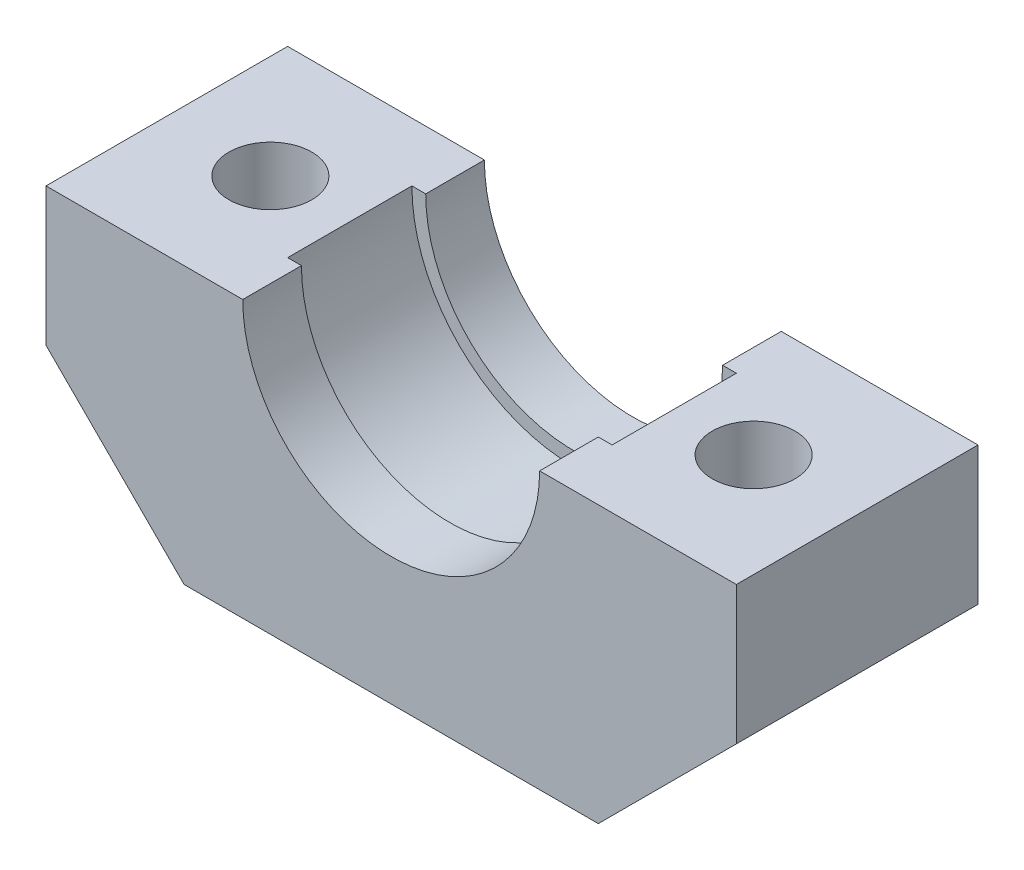
ISO-10303-21;
HEADER;
FILE_DESCRIPTION(('STEP AP214'),'2;1');
FILE_NAME('part.step','',(''),(''),'','','');
FILE_SCHEMA(('AUTOMOTIVE_DESIGN { 1 0 10303 214 1 1 1 1 }'));
ENDSEC;
DATA;
#1=APPLICATION_CONTEXT('core data for automotive mechanical design processes');
#2=APPLICATION_PROTOCOL_DEFINITION('international standard','automotive_design',2000,#1);
#3=PRODUCT_CONTEXT('',#1,'mechanical');
#4=PRODUCT('Part','Part','',(#3));
#5=PRODUCT_RELATED_PRODUCT_CATEGORY('part','',(#4));
#6=PRODUCT_DEFINITION_FORMATION('','',#4);
#7=PRODUCT_DEFINITION_CONTEXT('part definition',#1,'design');
#8=PRODUCT_DEFINITION('design','',#6,#7);
#9=PRODUCT_DEFINITION_SHAPE('','',#8);
#10=(LENGTH_UNIT() NAMED_UNIT(*) SI_UNIT(.MILLI.,.METRE.));
#11=(NAMED_UNIT(*) PLANE_ANGLE_UNIT() SI_UNIT($,.RADIAN.));
#12=(NAMED_UNIT(*) SI_UNIT($,.STERADIAN.) SOLID_ANGLE_UNIT());
#13=UNCERTAINTY_MEASURE_WITH_UNIT(LENGTH_MEASURE(1.E-05),#10,'distance_accuracy_value','');
#14=(GEOMETRIC_REPRESENTATION_CONTEXT(3) GLOBAL_UNCERTAINTY_ASSIGNED_CONTEXT((#13)) GLOBAL_UNIT_ASSIGNED_CONTEXT((#10,
#11,#12)) REPRESENTATION_CONTEXT('',''));
#15=CARTESIAN_POINT('',(0.,0.,0.));
#16=DIRECTION('',(0.,0.,1.));
#17=DIRECTION('',(1.,0.,0.));
#18=AXIS2_PLACEMENT_3D('',#15,#16,#17);
#19=CARTESIAN_POINT('',(28.4999999999999,-1.11022302462516E-13,17.5));
#20=DIRECTION('',(0.,-1.,0.));
#21=DIRECTION('',(1.,0.,0.));
#22=AXIS2_PLACEMENT_3D('',#19,#20,#21);
#23=PLANE('',#22);
#24=CARTESIAN_POINT('',(14.9999999999998,1.11022302462516E-13,0.));
#25=DIRECTION('',(0.,1.,0.));
#26=DIRECTION('',(0.,0.,1.));
#27=AXIS2_PLACEMENT_3D('',#24,#25,#26);
#28=CIRCLE('',#27,5.99999999999999);
#29=CARTESIAN_POINT('',(14.9999999999998,1.11065739355025E-13,5.99999999999999));
#30=VERTEX_POINT('',#29);
#31=EDGE_CURVE('E249',#30,#30,#28,.T.);
#32=ORIENTED_EDGE('',*,*,#31,.F.);
#33=EDGE_LOOP('',(#32));
#34=FACE_BOUND('',#33,.T.);
#35=DIRECTION('',(-1.,0.,0.));
#36=VECTOR('',#35,1.);
#37=CARTESIAN_POINT('',(28.4999999999999,-1.11022302462516E-13,-9.00000000000001));
#38=LINE('',#37,#36);
#39=CARTESIAN_POINT('',(28.4999999999999,-1.11022302462516E-13,-9.00000000000001));
#40=VERTEX_POINT('',#39);
#41=CARTESIAN_POINT('',(26.5,-1.11022302462516E-13,-9.00000000000001));
#42=VERTEX_POINT('',#41);
#43=EDGE_CURVE('E193',#40,#42,#38,.T.);
#44=ORIENTED_EDGE('',*,*,#43,.F.);
#45=DIRECTION('',(0.,0.,-1.));
#46=VECTOR('',#45,1.);
#47=CARTESIAN_POINT('',(28.4999999999999,-1.11022302462516E-13,17.5));
#48=LINE('',#47,#46);
#49=CARTESIAN_POINT('',(28.4999999999999,-1.11022302462516E-13,-17.5000000000001));
#50=VERTEX_POINT('',#49);
#51=EDGE_CURVE('E95',#40,#50,#48,.T.);
#52=ORIENTED_EDGE('',*,*,#51,.T.);
#53=DIRECTION('',(-1.,0.,0.));
#54=VECTOR('',#53,1.);
#55=CARTESIAN_POINT('',(28.4999999999999,-1.11022302462516E-13,-17.5000000000001));
#56=LINE('',#55,#54);
#57=CARTESIAN_POINT('',(1.11022302462516E-13,-1.11022302462516E-13,-17.5000000000003));
#58=VERTEX_POINT('',#57);
#59=EDGE_CURVE('E150',#50,#58,#56,.T.);
#60=ORIENTED_EDGE('',*,*,#59,.T.);
#61=DIRECTION('',(0.,0.,-1.));
#62=VECTOR('',#61,1.);
#63=CARTESIAN_POINT('',(-1.66533453693773E-13,1.11022302462516E-13,17.4999999999996));
#64=LINE('',#63,#62);
#65=CARTESIAN_POINT('',(-1.66533453693773E-13,1.11022302462516E-13,17.4999999999996));
#66=VERTEX_POINT('',#65);
#67=EDGE_CURVE('E182',#66,#58,#64,.T.);
#68=ORIENTED_EDGE('',*,*,#67,.F.);
#69=DIRECTION('',(-1.,0.,0.));
#70=VECTOR('',#69,1.);
#71=CARTESIAN_POINT('',(28.4999999999999,-1.11022302462516E-13,17.5));
#72=LINE('',#71,#70);
#73=CARTESIAN_POINT('',(28.4999999999999,-1.11022302462516E-13,17.5));
#74=VERTEX_POINT('',#73);
#75=EDGE_CURVE('E166',#74,#66,#72,.T.);
#76=ORIENTED_EDGE('',*,*,#75,.F.);
#77=CARTESIAN_POINT('',(28.4999999999999,-1.11022302462516E-13,9.00000000000001));
#78=VERTEX_POINT('',#77);
#79=EDGE_CURVE('E167',#74,#78,#48,.T.);
#80=ORIENTED_EDGE('',*,*,#79,.T.);
#81=DIRECTION('',(-1.,0.,0.));
#82=VECTOR('',#81,1.);
#83=CARTESIAN_POINT('',(28.4999999999999,-1.11022302462516E-13,9.00000000000001));
#84=LINE('',#83,#82);
#85=CARTESIAN_POINT('',(26.5000000000001,-1.11022302462516E-13,9.00000000000001));
#86=VERTEX_POINT('',#85);
#87=EDGE_CURVE('E52',#78,#86,#84,.T.);
#88=ORIENTED_EDGE('',*,*,#87,.T.);
#89=DIRECTION('',(0.,0.,1.));
#90=VECTOR('',#89,1.);
#91=CARTESIAN_POINT('',(26.5,-1.11022302462516E-13,-9.00000000000001));
#92=LINE('',#91,#90);
#93=EDGE_CURVE('E153',#86,#42,#92,.F.);
#94=ORIENTED_EDGE('',*,*,#93,.T.);
#95=EDGE_LOOP('',(#44,#52,#60,#68,#76,#80,#88,#94));
#96=FACE_BOUND('',#95,.T.);
#97=ADVANCED_FACE('F38',(#34,#96),#23,.F.);
#98=CARTESIAN_POINT('',(100.,-1.11022302462516E-13,17.5));
#99=DIRECTION('',(0.,-1.,0.));
#100=DIRECTION('',(1.,0.,0.));
#101=AXIS2_PLACEMENT_3D('',#98,#99,#100);
#102=PLANE('',#101);
#103=CARTESIAN_POINT('',(84.9999999999999,1.11022302462516E-13,-5.55111512312578E-13));
#104=DIRECTION('',(0.,1.,0.));
#105=DIRECTION('',(0.,0.,1.));
#106=AXIS2_PLACEMENT_3D('',#103,#104,#105);
#107=CIRCLE('',#106,5.99999999999999);
#108=CARTESIAN_POINT('',(84.9999999999999,1.11065739355025E-13,5.99999999999944));
#109=VERTEX_POINT('',#108);
#110=EDGE_CURVE('E243',#109,#109,#107,.T.);
#111=ORIENTED_EDGE('',*,*,#110,.F.);
#112=EDGE_LOOP('',(#111));
#113=FACE_BOUND('',#112,.T.);
#114=DIRECTION('',(-1.,0.,0.));
#115=VECTOR('',#114,1.);
#116=CARTESIAN_POINT('',(99.9999999999999,-1.11022302462516E-13,-9.00000000000001));
#117=LINE('',#116,#115);
#118=CARTESIAN_POINT('',(73.4999999999998,-1.11022302462516E-13,-9.00000000000056));
#119=VERTEX_POINT('',#118);
#120=CARTESIAN_POINT('',(71.5,-2.18522477890559E-06,-9.00000000000056));
#121=VERTEX_POINT('',#120);
#122=EDGE_CURVE('E196',#119,#121,#117,.T.);
#123=ORIENTED_EDGE('',*,*,#122,.F.);
#124=DIRECTION('',(0.,0.,1.));
#125=VECTOR('',#124,1.);
#126=CARTESIAN_POINT('',(73.4999999999998,-1.11022302462516E-13,-9.00000000000056));
#127=LINE('',#126,#125);
#128=CARTESIAN_POINT('',(73.4999999999998,-1.11022302462516E-13,8.99999999999945));
#129=VERTEX_POINT('',#128);
#130=EDGE_CURVE('E11',#119,#129,#127,.T.);
#131=ORIENTED_EDGE('',*,*,#130,.T.);
#132=DIRECTION('',(-1.,0.,0.));
#133=VECTOR('',#132,1.);
#134=CARTESIAN_POINT('',(99.9999999999999,-1.11022302462516E-13,9.00000000000001));
#135=LINE('',#134,#133);
#136=CARTESIAN_POINT('',(71.4999999999999,-2.18522477890559E-06,8.99999999999945));
#137=VERTEX_POINT('',#136);
#138=EDGE_CURVE('E233',#129,#137,#135,.T.);
#139=ORIENTED_EDGE('',*,*,#138,.T.);
#140=DIRECTION('',(0.,0.,-1.));
#141=VECTOR('',#140,1.);
#142=CARTESIAN_POINT('',(71.5,-1.11022302462516E-13,17.4999999999995));
#143=LINE('',#142,#141);
#144=CARTESIAN_POINT('',(71.5,-1.11022302462516E-13,17.4999999999995));
#145=VERTEX_POINT('',#144);
#146=EDGE_CURVE('E140',#145,#137,#143,.T.);
#147=ORIENTED_EDGE('',*,*,#146,.F.);
#148=DIRECTION('',(-1.,0.,0.));
#149=VECTOR('',#148,1.);
#150=CARTESIAN_POINT('',(100.,-1.11022302462516E-13,17.5));
#151=LINE('',#150,#149);
#152=CARTESIAN_POINT('',(100.,-1.11022302462516E-13,17.5));
#153=VERTEX_POINT('',#152);
#154=EDGE_CURVE('E123',#153,#145,#151,.T.);
#155=ORIENTED_EDGE('',*,*,#154,.F.);
#156=DIRECTION('',(0.,0.,-1.));
#157=VECTOR('',#156,1.);
#158=CARTESIAN_POINT('',(100.,-1.11022302462516E-13,17.5));
#159=LINE('',#158,#157);
#160=CARTESIAN_POINT('',(99.9999999999998,-1.11022302462516E-13,-17.5));
#161=VERTEX_POINT('',#160);
#162=EDGE_CURVE('E132',#153,#161,#159,.T.);
#163=ORIENTED_EDGE('',*,*,#162,.T.);
#164=DIRECTION('',(-1.,0.,0.));
#165=VECTOR('',#164,1.);
#166=CARTESIAN_POINT('',(99.9999999999998,-1.11022302462516E-13,-17.5));
#167=LINE('',#166,#165);
#168=CARTESIAN_POINT('',(71.4999999999999,-1.11022302462516E-13,-17.5000000000005));
#169=VERTEX_POINT('',#168);
#170=EDGE_CURVE('E162',#161,#169,#167,.T.);
#171=ORIENTED_EDGE('',*,*,#170,.T.);
#172=EDGE_CURVE('E170',#121,#169,#143,.T.);
#173=ORIENTED_EDGE('',*,*,#172,.F.);
#174=EDGE_LOOP('',(#123,#131,#139,#147,#155,#163,#171,#173));
#175=FACE_BOUND('',#174,.T.);
#176=ADVANCED_FACE('F143',(#113,#175),#102,.F.);
#177=CARTESIAN_POINT('',(49.9999999999999,-2.18522466788329E-06,17.4999999999997));
#178=DIRECTION('',(0.,0.,-1.));
#179=DIRECTION('',(-1.,0.,0.));
#180=AXIS2_PLACEMENT_3D('',#177,#178,#179);
#181=CYLINDRICAL_SURFACE('',#180,21.5000000000001);
#182=CARTESIAN_POINT('',(49.9999999999999,-2.18522477890559E-06,-9.00000000000034));
#183=DIRECTION('',(0.,0.,1.));
#184=DIRECTION('',(1.,0.,0.));
#185=AXIS2_PLACEMENT_3D('',#182,#183,#184);
#186=CIRCLE('',#185,21.5000000000001);
#187=EDGE_CURVE('E45',#121,#40,#186,.F.);
#188=ORIENTED_EDGE('',*,*,#187,.F.);
#189=ORIENTED_EDGE('',*,*,#172,.T.);
#190=CARTESIAN_POINT('',(49.9999999999998,-2.18522488992789E-06,-17.5000000000003));
#191=DIRECTION('',(0.,0.,-1.));
#192=DIRECTION('',(1.,0.,0.));
#193=AXIS2_PLACEMENT_3D('',#190,#191,#192);
#194=CIRCLE('',#193,21.5000000000001);
#195=EDGE_CURVE('E164',#169,#50,#194,.T.);
#196=ORIENTED_EDGE('',*,*,#195,.T.);
#197=ORIENTED_EDGE('',*,*,#51,.F.);
#198=EDGE_LOOP('',(#188,#189,#196,#197));
#199=FACE_BOUND('',#198,.T.);
#200=ADVANCED_FACE('F202',(#199),#181,.F.);
#201=CARTESIAN_POINT('',(-1.66533453693773E-13,1.11022302462516E-13,17.4999999999996));
#202=DIRECTION('',(1.,0.,0.));
#203=DIRECTION('',(0.,1.,0.));
#204=AXIS2_PLACEMENT_3D('',#201,#202,#203);
#205=PLANE('',#204);
#206=DIRECTION('',(0.,-1.,0.));
#207=VECTOR('',#206,1.);
#208=CARTESIAN_POINT('',(1.11022302462516E-13,-1.11022302462516E-13,-17.5000000000003));
#209=LINE('',#208,#207);
#210=CARTESIAN_POINT('',(0.,-20.,-17.5000000000003));
#211=VERTEX_POINT('',#210);
#212=EDGE_CURVE('E152',#58,#211,#209,.T.);
#213=ORIENTED_EDGE('',*,*,#212,.T.);
#214=DIRECTION('',(0.,0.,-1.));
#215=VECTOR('',#214,1.);
#216=CARTESIAN_POINT('',(-1.66533453693773E-13,-20.,17.4999999999997));
#217=LINE('',#216,#215);
#218=CARTESIAN_POINT('',(-1.66533453693773E-13,-20.,17.4999999999997));
#219=VERTEX_POINT('',#218);
#220=EDGE_CURVE('E179',#219,#211,#217,.T.);
#221=ORIENTED_EDGE('',*,*,#220,.F.);
#222=DIRECTION('',(0.,-1.,0.));
#223=VECTOR('',#222,1.);
#224=CARTESIAN_POINT('',(-1.66533453693773E-13,1.11022302462516E-13,17.4999999999996));
#225=LINE('',#224,#223);
#226=EDGE_CURVE('E104',#66,#219,#225,.T.);
#227=ORIENTED_EDGE('',*,*,#226,.F.);
#228=ORIENTED_EDGE('',*,*,#67,.T.);
#229=EDGE_LOOP('',(#213,#221,#227,#228));
#230=FACE_BOUND('',#229,.T.);
#231=ADVANCED_FACE('F210',(#230),#205,.F.);
#232=CARTESIAN_POINT('',(-1.66533453693773E-13,-20.,17.4999999999997));
#233=DIRECTION('',(0.707106781186548,0.707106781186549,0.));
#234=DIRECTION('',(-0.707106781186548,0.707106781186549,0.));
#235=AXIS2_PLACEMENT_3D('',#232,#233,#234);
#236=PLANE('',#235);
#237=DIRECTION('',(0.707106781186548,-0.707106781186549,0.));
#238=VECTOR('',#237,1.);
#239=CARTESIAN_POINT('',(0.,-20.,-17.5000000000003));
#240=LINE('',#239,#238);
#241=CARTESIAN_POINT('',(19.9999999999999,-40.0000000000001,-17.5000000000001));
#242=VERTEX_POINT('',#241);
#243=EDGE_CURVE('E155',#211,#242,#240,.T.);
#244=ORIENTED_EDGE('',*,*,#243,.T.);
#245=DIRECTION('',(0.,0.,-1.));
#246=VECTOR('',#245,1.);
#247=CARTESIAN_POINT('',(19.9999999999999,-39.9999999999999,17.5));
#248=LINE('',#247,#246);
#249=CARTESIAN_POINT('',(19.9999999999999,-39.9999999999999,17.5));
#250=VERTEX_POINT('',#249);
#251=EDGE_CURVE('E176',#250,#242,#248,.T.);
#252=ORIENTED_EDGE('',*,*,#251,.F.);
#253=DIRECTION('',(0.707106781186548,-0.707106781186549,0.));
#254=VECTOR('',#253,1.);
#255=CARTESIAN_POINT('',(-1.66533453693773E-13,-20.,17.4999999999997));
#256=LINE('',#255,#254);
#257=EDGE_CURVE('E215',#219,#250,#256,.T.);
#258=ORIENTED_EDGE('',*,*,#257,.F.);
#259=ORIENTED_EDGE('',*,*,#220,.T.);
#260=EDGE_LOOP('',(#244,#252,#258,#259));
#261=FACE_BOUND('',#260,.T.);
#262=ADVANCED_FACE('F213',(#261),#236,.F.);
#263=CARTESIAN_POINT('',(19.9999999999999,-39.9999999999999,17.5));
#264=DIRECTION('',(0.,1.,0.));
#265=DIRECTION('',(0.,0.,1.));
#266=AXIS2_PLACEMENT_3D('',#263,#264,#265);
#267=PLANE('',#266);
#268=DIRECTION('',(1.,0.,0.));
#269=VECTOR('',#268,1.);
#270=CARTESIAN_POINT('',(19.9999999999999,-40.0000000000001,-17.5000000000001));
#271=LINE('',#270,#269);
#272=CARTESIAN_POINT('',(79.9999999999998,-40.0000000000001,-17.5000000000005));
#273=VERTEX_POINT('',#272);
#274=EDGE_CURVE('E157',#242,#273,#271,.T.);
#275=ORIENTED_EDGE('',*,*,#274,.T.);
#276=DIRECTION('',(0.,0.,-1.));
#277=VECTOR('',#276,1.);
#278=CARTESIAN_POINT('',(79.9999999999999,-39.9999999999999,17.4999999999994));
#279=LINE('',#278,#277);
#280=CARTESIAN_POINT('',(79.9999999999999,-39.9999999999999,17.4999999999994));
#281=VERTEX_POINT('',#280);
#282=EDGE_CURVE('E173',#281,#273,#279,.T.);
#283=ORIENTED_EDGE('',*,*,#282,.F.);
#284=DIRECTION('',(1.,0.,0.));
#285=VECTOR('',#284,1.);
#286=CARTESIAN_POINT('',(19.9999999999999,-39.9999999999999,17.5));
#287=LINE('',#286,#285);
#288=EDGE_CURVE('E224',#250,#281,#287,.T.);
#289=ORIENTED_EDGE('',*,*,#288,.F.);
#290=ORIENTED_EDGE('',*,*,#251,.T.);
#291=EDGE_LOOP('',(#275,#283,#289,#290));
#292=FACE_BOUND('',#291,.T.);
#293=ADVANCED_FACE('F220',(#292),#267,.F.);
#294=CARTESIAN_POINT('',(79.9999999999999,-39.9999999999999,17.4999999999994));
#295=DIRECTION('',(-0.707106781186548,0.707106781186549,0.));
#296=DIRECTION('',(-0.707106781186548,-0.707106781186549,0.));
#297=AXIS2_PLACEMENT_3D('',#294,#295,#296);
#298=PLANE('',#297);
#299=CARTESIAN_POINT('',(83.5355339059327,-36.4644660940674,-2.22044604925031E-13));
#300=DIRECTION('',(0.707106781186548,-0.707106781186549,0.));
#301=DIRECTION('',(0.707106781186548,0.707106781186549,0.));
#302=AXIS2_PLACEMENT_3D('',#299,#300,#301);
#303=CIRCLE('',#302,2.49999999999999);
#304=CARTESIAN_POINT('',(85.3033008588991,-34.696699141101,-2.22031811088939E-13));
#305=VERTEX_POINT('',#304);
#306=EDGE_CURVE('E252',#305,#305,#303,.T.);
#307=ORIENTED_EDGE('',*,*,#306,.F.);
#308=EDGE_LOOP('',(#307));
#309=FACE_BOUND('',#308,.T.);
#310=DIRECTION('',(0.707106781186548,0.707106781186549,0.));
#311=VECTOR('',#310,1.);
#312=CARTESIAN_POINT('',(79.9999999999998,-40.0000000000001,-17.5000000000005));
#313=LINE('',#312,#311);
#314=CARTESIAN_POINT('',(99.9999999999999,-20.,-17.5000000000003));
#315=VERTEX_POINT('',#314);
#316=EDGE_CURVE('E159',#273,#315,#313,.T.);
#317=ORIENTED_EDGE('',*,*,#316,.T.);
#318=DIRECTION('',(0.,0.,-1.));
#319=VECTOR('',#318,1.);
#320=CARTESIAN_POINT('',(99.9999999999999,-19.9999999999999,17.4999999999997));
#321=LINE('',#320,#319);
#322=CARTESIAN_POINT('',(99.9999999999999,-19.9999999999999,17.4999999999997));
#323=VERTEX_POINT('',#322);
#324=EDGE_CURVE('E139',#323,#315,#321,.T.);
#325=ORIENTED_EDGE('',*,*,#324,.F.);
#326=DIRECTION('',(0.707106781186548,0.707106781186549,0.));
#327=VECTOR('',#326,1.);
#328=CARTESIAN_POINT('',(79.9999999999999,-39.9999999999999,17.4999999999994));
#329=LINE('',#328,#327);
#330=EDGE_CURVE('E126',#281,#323,#329,.T.);
#331=ORIENTED_EDGE('',*,*,#330,.F.);
#332=ORIENTED_EDGE('',*,*,#282,.T.);
#333=EDGE_LOOP('',(#317,#325,#331,#332));
#334=FACE_BOUND('',#333,.T.);
#335=ADVANCED_FACE('F223',(#309,#334),#298,.F.);
#336=CARTESIAN_POINT('',(99.9999999999999,-19.9999999999999,17.4999999999997));
#337=DIRECTION('',(-1.,0.,0.));
#338=DIRECTION('',(0.,0.,1.));
#339=AXIS2_PLACEMENT_3D('',#336,#337,#338);
#340=PLANE('',#339);
#341=DIRECTION('',(0.,1.,0.));
#342=VECTOR('',#341,1.);
#343=CARTESIAN_POINT('',(99.9999999999999,-20.,-17.5000000000003));
#344=LINE('',#343,#342);
#345=EDGE_CURVE('E135',#315,#161,#344,.T.);
#346=ORIENTED_EDGE('',*,*,#345,.T.);
#347=ORIENTED_EDGE('',*,*,#162,.F.);
#348=DIRECTION('',(0.,1.,0.));
#349=VECTOR('',#348,1.);
#350=CARTESIAN_POINT('',(99.9999999999999,-19.9999999999999,17.4999999999997));
#351=LINE('',#350,#349);
#352=EDGE_CURVE('E119',#323,#153,#351,.T.);
#353=ORIENTED_EDGE('',*,*,#352,.F.);
#354=ORIENTED_EDGE('',*,*,#324,.T.);
#355=EDGE_LOOP('',(#346,#347,#353,#354));
#356=FACE_BOUND('',#355,.T.);
#357=ADVANCED_FACE('F133',(#356),#340,.F.);
#358=ORIENTED_EDGE('',*,*,#146,.T.);
#359=CARTESIAN_POINT('',(49.9999999999999,-2.18522477890559E-06,8.99999999999967));
#360=DIRECTION('',(0.,0.,1.));
#361=DIRECTION('',(1.,0.,0.));
#362=AXIS2_PLACEMENT_3D('',#359,#360,#361);
#363=CIRCLE('',#362,21.5000000000001);
#364=EDGE_CURVE('E184',#137,#78,#363,.F.);
#365=ORIENTED_EDGE('',*,*,#364,.T.);
#366=ORIENTED_EDGE('',*,*,#79,.F.);
#367=CARTESIAN_POINT('',(49.9999999999999,-2.18522466788329E-06,17.4999999999997));
#368=DIRECTION('',(0.,0.,-1.));
#369=DIRECTION('',(1.,0.,0.));
#370=AXIS2_PLACEMENT_3D('',#367,#368,#369);
#371=CIRCLE('',#370,21.5000000000001);
#372=EDGE_CURVE('E61',#145,#74,#371,.T.);
#373=ORIENTED_EDGE('',*,*,#372,.F.);
#374=EDGE_LOOP('',(#358,#365,#366,#373));
#375=FACE_BOUND('',#374,.T.);
#376=ADVANCED_FACE('F306',(#375),#181,.F.);
#377=CARTESIAN_POINT('',(49.9999999999999,-2.18522466788329E-06,17.4999999999997));
#378=DIRECTION('',(0.,0.,1.));
#379=DIRECTION('',(1.,0.,0.));
#380=AXIS2_PLACEMENT_3D('',#377,#378,#379);
#381=PLANE('',#380);
#382=ORIENTED_EDGE('',*,*,#75,.T.);
#383=ORIENTED_EDGE('',*,*,#226,.T.);
#384=ORIENTED_EDGE('',*,*,#257,.T.);
#385=ORIENTED_EDGE('',*,*,#288,.T.);
#386=ORIENTED_EDGE('',*,*,#330,.T.);
#387=ORIENTED_EDGE('',*,*,#352,.T.);
#388=ORIENTED_EDGE('',*,*,#154,.T.);
#389=ORIENTED_EDGE('',*,*,#372,.T.);
#390=EDGE_LOOP('',(#382,#383,#384,#385,#386,#387,#388,#389));
#391=FACE_BOUND('',#390,.T.);
#392=ADVANCED_FACE('F121',(#391),#381,.T.);
#393=CARTESIAN_POINT('',(49.9999999999998,-2.18522488992789E-06,-17.5000000000003));
#394=DIRECTION('',(0.,0.,1.));
#395=DIRECTION('',(1.,0.,0.));
#396=AXIS2_PLACEMENT_3D('',#393,#394,#395);
#397=PLANE('',#396);
#398=ORIENTED_EDGE('',*,*,#59,.F.);
#399=ORIENTED_EDGE('',*,*,#195,.F.);
#400=ORIENTED_EDGE('',*,*,#170,.F.);
#401=ORIENTED_EDGE('',*,*,#345,.F.);
#402=ORIENTED_EDGE('',*,*,#316,.F.);
#403=ORIENTED_EDGE('',*,*,#274,.F.);
#404=ORIENTED_EDGE('',*,*,#243,.F.);
#405=ORIENTED_EDGE('',*,*,#212,.F.);
#406=EDGE_LOOP('',(#398,#399,#400,#401,#402,#403,#404,#405));
#407=FACE_BOUND('',#406,.T.);
#408=ADVANCED_FACE('F206',(#407),#397,.F.);
#409=CARTESIAN_POINT('',(49.9999999999999,-2.18522477890559E-06,-9.00000000000023));
#410=DIRECTION('',(0.,0.,1.));
#411=DIRECTION('',(1.,0.,0.));
#412=AXIS2_PLACEMENT_3D('',#409,#410,#411);
#413=CYLINDRICAL_SURFACE('',#412,23.5);
#414=CARTESIAN_POINT('',(66.9175430694863,-16.3109413516882,-2.22044604925031E-13));
#415=CARTESIAN_POINT('',(66.917539715428,-16.3109463979526,0.14043709387495));
#416=CARTESIAN_POINT('',(66.9093079780531,-16.3194960832725,0.280965450057372));
#417=CARTESIAN_POINT('',(66.8765129469494,-16.3534069120574,0.55813948220931));
#418=CARTESIAN_POINT('',(66.8519319435179,-16.3787862855343,0.694780780125926));
#419=CARTESIAN_POINT('',(66.7869178109053,-16.4454132343716,0.960143506697454));
#420=CARTESIAN_POINT('',(66.7464915352159,-16.4866539491455,1.08886833162172));
#421=CARTESIAN_POINT('',(66.6506049017876,-16.5834872457945,1.3347659526855));
#422=CARTESIAN_POINT('',(66.5951478401806,-16.6390766809819,1.45194127386615));
#423=CARTESIAN_POINT('',(66.4703564587993,-16.7626106628878,1.67144112948376));
#424=CARTESIAN_POINT('',(66.4010229506232,-16.8305544870082,1.77376653185129));
#425=CARTESIAN_POINT('',(66.2500017731221,-16.9764104760256,1.96066176509413));
#426=CARTESIAN_POINT('',(66.1683139042594,-17.0543228019227,2.04523130913849));
#427=CARTESIAN_POINT('',(65.9946725309082,-17.2172777337704,2.19405651597188));
#428=CARTESIAN_POINT('',(65.9027398568567,-17.3023057868923,2.25835241622135));
#429=CARTESIAN_POINT('',(65.7107584955868,-17.4768118834317,2.36505631249942));
#430=CARTESIAN_POINT('',(65.6107099869186,-17.5662898289337,2.40746478990521));
#431=CARTESIAN_POINT('',(65.4052836240823,-17.746716968396,2.46920126695664));
#432=CARTESIAN_POINT('',(65.2999146467525,-17.8376635501098,2.48856646747808));
#433=CARTESIAN_POINT('',(65.0865721401381,-18.0184619260894,2.50389188568737));
#434=CARTESIAN_POINT('',(64.9785985606953,-18.1083136992216,2.49985165228643));
#435=CARTESIAN_POINT('',(64.7626285307724,-18.2848138058624,2.46852371102295));
#436=CARTESIAN_POINT('',(64.6546339795446,-18.3714466981013,2.44113608383504));
#437=CARTESIAN_POINT('',(64.4422401405273,-18.5388802995531,2.36384433311063));
#438=CARTESIAN_POINT('',(64.3378410899465,-18.6196806243531,2.31393872702843));
#439=CARTESIAN_POINT('',(64.1347972816674,-18.774292055734,2.19245426361295));
#440=CARTESIAN_POINT('',(64.0362177131337,-18.8480282598815,2.12067107113133));
#441=CARTESIAN_POINT('',(63.8490356596651,-18.9859904936977,1.95759626755379));
#442=CARTESIAN_POINT('',(63.760433637804,-19.0502160820069,1.86630375156822));
#443=CARTESIAN_POINT('',(63.5957658747619,-19.1680868984566,1.66623017690321));
#444=CARTESIAN_POINT('',(63.5197592634571,-19.2216824425207,1.55737111640797));
#445=CARTESIAN_POINT('',(63.3834692581028,-19.3168259872731,1.32546340639511));
#446=CARTESIAN_POINT('',(63.3231850293153,-19.3583746275729,1.20241551069629));
#447=CARTESIAN_POINT('',(63.2210932503046,-19.428242002603,0.946828051408499));
#448=CARTESIAN_POINT('',(63.1791148051062,-19.4566832510735,0.814390315039674));
#449=CARTESIAN_POINT('',(63.1144445682653,-19.5003324975694,0.542797502789418));
#450=CARTESIAN_POINT('',(63.0917505393248,-19.5155420306886,0.403643208115386));
#451=CARTESIAN_POINT('',(63.0667766199694,-19.5322722252149,0.125084368977753));
#452=CARTESIAN_POINT('',(63.0641589896875,-19.5340193632346,-0.0142763981953614));
#453=CARTESIAN_POINT('',(63.0785511096671,-19.5243862636765,-0.291517192537117));
#454=CARTESIAN_POINT('',(63.0955599336822,-19.5130066455998,-0.429397289274241));
#455=CARTESIAN_POINT('',(63.1483585007257,-19.4774676556973,-0.698860453159516));
#456=CARTESIAN_POINT('',(63.1840266206759,-19.4533910360379,-0.830478347308421));
#457=CARTESIAN_POINT('',(63.2727237776059,-19.3929819985035,-1.08474148782306));
#458=CARTESIAN_POINT('',(63.3257537862134,-19.3566488947124,-1.20738623155205));
#459=CARTESIAN_POINT('',(63.4479424704541,-19.2719613134506,-1.44170804282434));
#460=CARTESIAN_POINT('',(63.5172717594021,-19.2234792862302,-1.55324997780742));
#461=CARTESIAN_POINT('',(63.6693415437055,-19.1156442331202,-1.76086569842677));
#462=CARTESIAN_POINT('',(63.7520833250961,-19.0562901647114,-1.85693799901952));
#463=CARTESIAN_POINT('',(63.929734177574,-18.9268286408266,-2.03252716211696));
#464=CARTESIAN_POINT('',(64.0248208414179,-18.8565605109802,-2.11174604300872));
#465=CARTESIAN_POINT('',(64.2230200335658,-18.7075156023549,-2.24942759378813));
#466=CARTESIAN_POINT('',(64.3261328820085,-18.6287384841313,-2.30788943522649));
#467=CARTESIAN_POINT('',(64.5378248494873,-18.4640137554593,-2.40266741158229));
#468=CARTESIAN_POINT('',(64.6464324864328,-18.378026792337,-2.43885162342404));
#469=CARTESIAN_POINT('',(64.865251438625,-18.2014870323032,-2.48740372079398));
#470=CARTESIAN_POINT('',(64.9754626915361,-18.1109344125315,-2.499772529591));
#471=CARTESIAN_POINT('',(65.1934658266887,-17.9284338957401,-2.50021966291928));
#472=CARTESIAN_POINT('',(65.3012692540206,-17.8365002327141,-2.48846768612572));
#473=CARTESIAN_POINT('',(65.5121997222066,-17.6533636704465,-2.4412447771369));
#474=CARTESIAN_POINT('',(65.6153269969005,-17.5621607348517,-2.40577503239281));
#475=CARTESIAN_POINT('',(65.8132208267167,-17.3841793918156,-2.31249084697113));
#476=CARTESIAN_POINT('',(65.9080537575064,-17.2973687727645,-2.25487855556628));
#477=CARTESIAN_POINT('',(66.087979986036,-17.1301511149502,-2.11890311541905));
#478=CARTESIAN_POINT('',(66.1730737417595,-17.0497437751275,-2.04054094301238));
#479=CARTESIAN_POINT('',(66.3313047367416,-16.8982410901902,-1.86550095476671));
#480=CARTESIAN_POINT('',(66.4044704846938,-16.8271236250917,-1.76886803873939));
#481=CARTESIAN_POINT('',(66.5374817945336,-16.6964214301842,-1.55986730673384));
#482=CARTESIAN_POINT('',(66.5973242488919,-16.6368393913233,-1.44749582982428));
#483=CARTESIAN_POINT('',(66.7025461718227,-16.5312012505428,-1.20990556001101));
#484=CARTESIAN_POINT('',(66.7478865858393,-16.4851816986549,-1.08465325610471));
#485=CARTESIAN_POINT('',(66.8229339843151,-16.4085911749279,-0.825179763872742));
#486=CARTESIAN_POINT('',(66.8526577084848,-16.3780036627105,-0.690968353618985));
#487=CARTESIAN_POINT('',(66.8886806522374,-16.3408365593455,-0.46337187899186));
#488=CARTESIAN_POINT('',(66.8994934959928,-16.3296448355535,-0.371402291798843));
#489=CARTESIAN_POINT('',(66.9139258197108,-16.3146955552126,-0.186301859891168));
#490=CARTESIAN_POINT('',(66.9175452946891,-16.3109380038151,-0.0931710143718798));
#491=CARTESIAN_POINT('',(66.9175430694863,-16.3109413516882,-2.22044604925031E-13));
#492=B_SPLINE_CURVE_WITH_KNOTS('',3,(#414,#415,#416,#417,#418,#419,#420,#421,#422,#423,#424,
#425,#426,#427,#428,#429,#430,#431,#432,#433,#434,#435,#436,#437,#438,#439,#440,#441,#442,#443,
#444,#445,#446,#447,#448,#449,#450,#451,#452,#453,#454,#455,#456,#457,#458,#459,#460,#461,#462,
#463,#464,#465,#466,#467,#468,#469,#470,#471,#472,#473,#474,#475,#476,#477,#478,#479,#480,#481,
#482,#483,#484,#485,#486,#487,#488,#489,#490,#491),.UNSPECIFIED.,.T.,.F.,(4,2,2,2,2,2,2,2,2,2,2,
2,2,2,2,2,2,2,2,2,2,2,2,2,2,2,2,2,2,2,2,2,2,2,2,2,2,2,4),(0.,0.420972507549398,0.84240176136025,
1.26364893686236,1.68480381084078,2.10593405973307,2.52707111110667,2.94736698516291,
3.36765361512201,3.78726081327684,4.20687609847398,4.62829626970161,5.04974419057128,
5.4752557385925,5.90078702715489,6.32826263115698,6.75571553485951,7.17908772471925,
7.60241078998292,8.01859644551709,8.43476246048348,8.84824905534113,9.26175879420978,
9.67980648999294,10.0978942933421,10.5228521602785,10.9478269861111,11.3752948016035,
11.8027460448106,12.2272003198036,12.6516333457062,13.0722802002436,13.492907265772,
13.9125137806517,14.3322180623984,14.7530432888393,15.1734165027717,15.4527045974634,
15.7319928856832),.UNSPECIFIED.);
#493=CARTESIAN_POINT('',(66.9175430694863,-16.3109413516882,-2.22044604925031E-13));
#494=VERTEX_POINT('',#493);
#495=EDGE_CURVE('E255',#494,#494,#492,.T.);
#496=ORIENTED_EDGE('',*,*,#495,.T.);
#497=EDGE_LOOP('',(#496));
#498=FACE_BOUND('',#497,.T.);
#499=CARTESIAN_POINT('',(49.9999999999999,-2.18522477890559E-06,8.99999999999967));
#500=DIRECTION('',(0.,0.,1.));
#501=DIRECTION('',(1.,0.,0.));
#502=AXIS2_PLACEMENT_3D('',#499,#500,#501);
#503=CIRCLE('',#502,23.5);
#504=EDGE_CURVE('E236',#86,#129,#503,.T.);
#505=ORIENTED_EDGE('',*,*,#504,.T.);
#506=ORIENTED_EDGE('',*,*,#130,.F.);
#507=CARTESIAN_POINT('',(49.9999999999999,-2.18522477890559E-06,-9.00000000000023));
#508=DIRECTION('',(0.,0.,1.));
#509=DIRECTION('',(1.,0.,0.));
#510=AXIS2_PLACEMENT_3D('',#507,#508,#509);
#511=CIRCLE('',#510,23.5);
#512=EDGE_CURVE('E235',#42,#119,#511,.T.);
#513=ORIENTED_EDGE('',*,*,#512,.F.);
#514=ORIENTED_EDGE('',*,*,#93,.F.);
#515=EDGE_LOOP('',(#505,#506,#513,#514));
#516=FACE_BOUND('',#515,.T.);
#517=ADVANCED_FACE('F262',(#498,#516),#413,.F.);
#518=CARTESIAN_POINT('',(49.9999999999999,-2.18522477890559E-06,-9.00000000000023));
#519=DIRECTION('',(0.,0.,1.));
#520=DIRECTION('',(1.,0.,0.));
#521=AXIS2_PLACEMENT_3D('',#518,#519,#520);
#522=PLANE('',#521);
#523=ORIENTED_EDGE('',*,*,#43,.T.);
#524=ORIENTED_EDGE('',*,*,#512,.T.);
#525=ORIENTED_EDGE('',*,*,#122,.T.);
#526=ORIENTED_EDGE('',*,*,#187,.T.);
#527=EDGE_LOOP('',(#523,#524,#525,#526));
#528=FACE_BOUND('',#527,.T.);
#529=ADVANCED_FACE('F190',(#528),#522,.T.);
#530=CARTESIAN_POINT('',(49.9999999999999,-2.18522477890559E-06,8.99999999999967));
#531=DIRECTION('',(0.,0.,1.));
#532=DIRECTION('',(1.,0.,0.));
#533=AXIS2_PLACEMENT_3D('',#530,#531,#532);
#534=PLANE('',#533);
#535=ORIENTED_EDGE('',*,*,#364,.F.);
#536=ORIENTED_EDGE('',*,*,#138,.F.);
#537=ORIENTED_EDGE('',*,*,#504,.F.);
#538=ORIENTED_EDGE('',*,*,#87,.F.);
#539=EDGE_LOOP('',(#535,#536,#537,#538));
#540=FACE_BOUND('',#539,.T.);
#541=ADVANCED_FACE('F287',(#540),#534,.F.);
#542=CARTESIAN_POINT('',(84.9999999999999,-19.9999999999999,-5.55111512312578E-13));
#543=DIRECTION('',(0.,1.,0.));
#544=DIRECTION('',(0.,0.,1.));
#545=AXIS2_PLACEMENT_3D('',#542,#543,#544);
#546=CONICAL_SURFACE('',#545,5.99999999999999,1.02974425867665);
#547=CARTESIAN_POINT('',(84.9999999999999,-23.6051637141653,-2.22044604925031E-13));
#548=VERTEX_POINT('',#547);
#549=VERTEX_LOOP('',#548);
#550=FACE_BOUND('',#549,.T.);
#551=CARTESIAN_POINT('',(84.9999999999999,-19.9999999999999,-5.55111512312578E-13));
#552=DIRECTION('',(0.,1.,0.));
#553=DIRECTION('',(0.,0.,1.));
#554=AXIS2_PLACEMENT_3D('',#551,#552,#553);
#555=CIRCLE('',#554,5.99999999999999);
#556=CARTESIAN_POINT('',(84.9999999999999,-19.9999999999999,5.99999999999944));
#557=VERTEX_POINT('',#556);
#558=EDGE_CURVE('E239',#557,#557,#555,.T.);
#559=ORIENTED_EDGE('',*,*,#558,.T.);
#560=EDGE_LOOP('',(#559));
#561=FACE_BOUND('',#560,.T.);
#562=ADVANCED_FACE('F283',(#550,#561),#546,.F.);
#563=CARTESIAN_POINT('',(84.9999999999999,1.11022302462516E-13,-5.55111512312578E-13));
#564=DIRECTION('',(0.,1.,0.));
#565=DIRECTION('',(0.,0.,1.));
#566=AXIS2_PLACEMENT_3D('',#563,#564,#565);
#567=CYLINDRICAL_SURFACE('',#566,5.99999999999999);
#568=ORIENTED_EDGE('',*,*,#558,.F.);
#569=EDGE_LOOP('',(#568));
#570=FACE_BOUND('',#569,.T.);
#571=ORIENTED_EDGE('',*,*,#110,.T.);
#572=EDGE_LOOP('',(#571));
#573=FACE_BOUND('',#572,.T.);
#574=ADVANCED_FACE('F279',(#570,#573),#567,.F.);
#575=CARTESIAN_POINT('',(14.9999999999998,-19.9999999999999,-3.33066907387547E-13));
#576=DIRECTION('',(0.,1.,0.));
#577=DIRECTION('',(0.,0.,1.));
#578=AXIS2_PLACEMENT_3D('',#575,#576,#577);
#579=CONICAL_SURFACE('',#578,5.99999999999999,1.02974425867665);
#580=CARTESIAN_POINT('',(15.,-23.6051637141653,-3.33066907387547E-13));
#581=VERTEX_POINT('',#580);
#582=VERTEX_LOOP('',#581);
#583=FACE_BOUND('',#582,.T.);
#584=CARTESIAN_POINT('',(14.9999999999998,-19.9999999999999,-3.33066907387547E-13));
#585=DIRECTION('',(0.,1.,0.));
#586=DIRECTION('',(0.,0.,1.));
#587=AXIS2_PLACEMENT_3D('',#584,#585,#586);
#588=CIRCLE('',#587,5.99999999999999);
#589=CARTESIAN_POINT('',(14.9999999999998,-19.9999999999999,5.99999999999966));
#590=VERTEX_POINT('',#589);
#591=EDGE_CURVE('E246',#590,#590,#588,.T.);
#592=ORIENTED_EDGE('',*,*,#591,.T.);
#593=EDGE_LOOP('',(#592));
#594=FACE_BOUND('',#593,.T.);
#595=ADVANCED_FACE('F275',(#583,#594),#579,.F.);
#596=CARTESIAN_POINT('',(14.9999999999998,1.11022302462516E-13,0.));
#597=DIRECTION('',(0.,1.,0.));
#598=DIRECTION('',(0.,0.,1.));
#599=AXIS2_PLACEMENT_3D('',#596,#597,#598);
#600=CYLINDRICAL_SURFACE('',#599,5.99999999999999);
#601=ORIENTED_EDGE('',*,*,#591,.F.);
#602=EDGE_LOOP('',(#601));
#603=FACE_BOUND('',#602,.T.);
#604=ORIENTED_EDGE('',*,*,#31,.T.);
#605=EDGE_LOOP('',(#604));
#606=FACE_BOUND('',#605,.T.);
#607=ADVANCED_FACE('F271',(#603,#606),#600,.F.);
#608=CARTESIAN_POINT('',(83.5355339059327,-36.4644660940674,-2.22044604925031E-13));
#609=DIRECTION('',(0.707106781186548,-0.707106781186549,0.));
#610=DIRECTION('',(0.707106781186548,0.707106781186549,0.));
#611=AXIS2_PLACEMENT_3D('',#608,#609,#610);
#612=CYLINDRICAL_SURFACE('',#611,2.49999999999999);
#613=ORIENTED_EDGE('',*,*,#306,.T.);
#614=EDGE_LOOP('',(#613));
#615=FACE_BOUND('',#614,.T.);
#616=ORIENTED_EDGE('',*,*,#495,.F.);
#617=EDGE_LOOP('',(#616));
#618=FACE_BOUND('',#617,.T.);
#619=ADVANCED_FACE('F268',(#615,#618),#612,.F.);
#620=CLOSED_SHELL('',(#97,#176,#200,#231,#262,#293,#335,#357,#376,#392,#408,#517,#529,#541,#562,
#574,#595,#607,#619));
#621=MANIFOLD_SOLID_BREP('B2',#620);
#622=ADVANCED_BREP_SHAPE_REPRESENTATION('',(#18,#621),#14);
#623=SHAPE_DEFINITION_REPRESENTATION(#9,#622);
ENDSEC;
END-ISO-10303-21;
